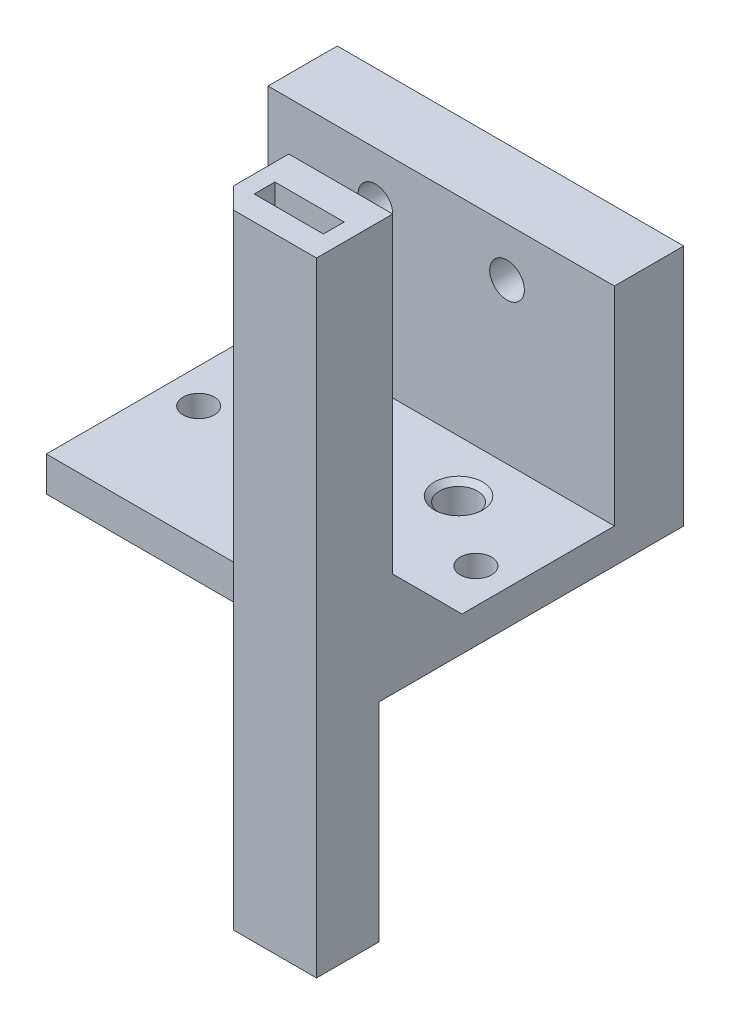
ISO-10303-21;
HEADER;
FILE_DESCRIPTION(('STEP AP214'),'2;1');
FILE_NAME('part.step','',(''),(''),'','','');
FILE_SCHEMA(('AUTOMOTIVE_DESIGN { 1 0 10303 214 1 1 1 1 }'));
ENDSEC;
DATA;
#1=APPLICATION_CONTEXT('core data for automotive mechanical design processes');
#2=APPLICATION_PROTOCOL_DEFINITION('international standard','automotive_design',2000,#1);
#3=PRODUCT_CONTEXT('',#1,'mechanical');
#4=PRODUCT('Part','Part','',(#3));
#5=PRODUCT_RELATED_PRODUCT_CATEGORY('part','',(#4));
#6=PRODUCT_DEFINITION_FORMATION('','',#4);
#7=PRODUCT_DEFINITION_CONTEXT('part definition',#1,'design');
#8=PRODUCT_DEFINITION('design','',#6,#7);
#9=PRODUCT_DEFINITION_SHAPE('','',#8);
#10=(LENGTH_UNIT() NAMED_UNIT(*) SI_UNIT(.MILLI.,.METRE.));
#11=(NAMED_UNIT(*) PLANE_ANGLE_UNIT() SI_UNIT($,.RADIAN.));
#12=(NAMED_UNIT(*) SI_UNIT($,.STERADIAN.) SOLID_ANGLE_UNIT());
#13=UNCERTAINTY_MEASURE_WITH_UNIT(LENGTH_MEASURE(1.E-05),#10,'distance_accuracy_value','');
#14=(GEOMETRIC_REPRESENTATION_CONTEXT(3) GLOBAL_UNCERTAINTY_ASSIGNED_CONTEXT((#13)) GLOBAL_UNIT_ASSIGNED_CONTEXT((#10,
#11,#12)) REPRESENTATION_CONTEXT('',''));
#15=CARTESIAN_POINT('',(0.,0.,0.));
#16=DIRECTION('',(0.,0.,1.));
#17=DIRECTION('',(1.,0.,0.));
#18=AXIS2_PLACEMENT_3D('',#15,#16,#17);
#19=CARTESIAN_POINT('',(-25.,5.,2.));
#20=DIRECTION('',(0.,0.,-1.));
#21=DIRECTION('',(-1.,0.,0.));
#22=AXIS2_PLACEMENT_3D('',#19,#20,#21);
#23=PLANE('',#22);
#24=DIRECTION('',(1.,0.,0.));
#25=VECTOR('',#24,1.);
#26=CARTESIAN_POINT('',(-25.,0.,2.));
#27=LINE('',#26,#25);
#28=CARTESIAN_POINT('',(-25.,0.,2.));
#29=VERTEX_POINT('',#28);
#30=CARTESIAN_POINT('',(4.99999999999997,0.,2.));
#31=VERTEX_POINT('',#30);
#32=EDGE_CURVE('E177',#29,#31,#27,.T.);
#33=ORIENTED_EDGE('',*,*,#32,.T.);
#34=DIRECTION('',(0.,1.,0.));
#35=VECTOR('',#34,1.);
#36=CARTESIAN_POINT('',(4.99999999999997,5.,2.));
#37=LINE('',#36,#35);
#38=CARTESIAN_POINT('',(4.99999999999997,5.,2.));
#39=VERTEX_POINT('',#38);
#40=EDGE_CURVE('E364',#31,#39,#37,.T.);
#41=ORIENTED_EDGE('',*,*,#40,.T.);
#42=DIRECTION('',(1.,0.,0.));
#43=VECTOR('',#42,1.);
#44=CARTESIAN_POINT('',(-25.,5.,2.));
#45=LINE('',#44,#43);
#46=CARTESIAN_POINT('',(-25.,5.,2.));
#47=VERTEX_POINT('',#46);
#48=EDGE_CURVE('E311',#47,#39,#45,.T.);
#49=ORIENTED_EDGE('',*,*,#48,.F.);
#50=DIRECTION('',(0.,-1.,0.));
#51=VECTOR('',#50,1.);
#52=CARTESIAN_POINT('',(-25.,5.,2.));
#53=LINE('',#52,#51);
#54=EDGE_CURVE('E314',#47,#29,#53,.T.);
#55=ORIENTED_EDGE('',*,*,#54,.T.);
#56=EDGE_LOOP('',(#33,#41,#49,#55));
#57=FACE_BOUND('',#56,.T.);
#58=ADVANCED_FACE('F32',(#57),#23,.F.);
#59=CARTESIAN_POINT('',(0.,5.,0.));
#60=DIRECTION('',(0.,-1.,0.));
#61=DIRECTION('',(0.,0.,-1.));
#62=AXIS2_PLACEMENT_3D('',#59,#60,#61);
#63=PLANE('',#62);
#64=CARTESIAN_POINT('',(0.,5.,-6.));
#65=DIRECTION('',(0.,-1.,0.));
#66=DIRECTION('',(0.,0.,-1.));
#67=AXIS2_PLACEMENT_3D('',#64,#65,#66);
#68=CIRCLE('',#67,3.50000000000002);
#69=CARTESIAN_POINT('',(0.,5.,-9.50000000000002));
#70=VERTEX_POINT('',#69);
#71=EDGE_CURVE('E340',#70,#70,#68,.T.);
#72=ORIENTED_EDGE('',*,*,#71,.T.);
#73=EDGE_LOOP('',(#72));
#74=FACE_BOUND('',#73,.T.);
#75=CARTESIAN_POINT('',(-10.,5.,-22.5));
#76=DIRECTION('',(0.,-1.,0.));
#77=DIRECTION('',(0.,0.,-1.));
#78=AXIS2_PLACEMENT_3D('',#75,#76,#77);
#79=CIRCLE('',#78,3.50000000000002);
#80=CARTESIAN_POINT('',(-10.,5.,-26.));
#81=VERTEX_POINT('',#80);
#82=EDGE_CURVE('E337',#81,#81,#79,.T.);
#83=ORIENTED_EDGE('',*,*,#82,.T.);
#84=EDGE_LOOP('',(#83));
#85=FACE_BOUND('',#84,.T.);
#86=CARTESIAN_POINT('',(10.,5.,-22.5));
#87=DIRECTION('',(0.,-1.,0.));
#88=DIRECTION('',(0.,0.,-1.));
#89=AXIS2_PLACEMENT_3D('',#86,#87,#88);
#90=CIRCLE('',#89,3.50000000000002);
#91=CARTESIAN_POINT('',(10.,5.,-26.));
#92=VERTEX_POINT('',#91);
#93=EDGE_CURVE('E334',#92,#92,#90,.T.);
#94=ORIENTED_EDGE('',*,*,#93,.T.);
#95=EDGE_LOOP('',(#94));
#96=FACE_BOUND('',#95,.T.);
#97=CARTESIAN_POINT('',(20.,5.,-15.));
#98=DIRECTION('',(0.,1.,0.));
#99=DIRECTION('',(0.,0.,1.));
#100=AXIS2_PLACEMENT_3D('',#97,#98,#99);
#101=CIRCLE('',#100,2.25);
#102=CARTESIAN_POINT('',(20.,5.,-12.75));
#103=VERTEX_POINT('',#102);
#104=EDGE_CURVE('E288',#103,#103,#101,.T.);
#105=ORIENTED_EDGE('',*,*,#104,.F.);
#106=EDGE_LOOP('',(#105));
#107=FACE_BOUND('',#106,.T.);
#108=CARTESIAN_POINT('',(-20.,5.,-15.));
#109=DIRECTION('',(0.,1.,0.));
#110=DIRECTION('',(0.,0.,1.));
#111=AXIS2_PLACEMENT_3D('',#108,#109,#110);
#112=CIRCLE('',#111,2.25);
#113=CARTESIAN_POINT('',(-20.,5.,-12.75));
#114=VERTEX_POINT('',#113);
#115=EDGE_CURVE('E294',#114,#114,#112,.T.);
#116=ORIENTED_EDGE('',*,*,#115,.F.);
#117=EDGE_LOOP('',(#116));
#118=FACE_BOUND('',#117,.T.);
#119=ORIENTED_EDGE('',*,*,#48,.T.);
#120=DIRECTION('',(0.,0.,-1.));
#121=VECTOR('',#120,1.);
#122=CARTESIAN_POINT('',(4.99999999999997,5.,0.));
#123=LINE('',#122,#121);
#124=CARTESIAN_POINT('',(4.99999999999997,5.,-8.00000000000006));
#125=VERTEX_POINT('',#124);
#126=EDGE_CURVE('E366',#39,#125,#123,.T.);
#127=ORIENTED_EDGE('',*,*,#126,.T.);
#128=DIRECTION('',(1.,0.,0.));
#129=VECTOR('',#128,1.);
#130=CARTESIAN_POINT('',(0.,5.,-8.00000000000006));
#131=LINE('',#130,#129);
#132=CARTESIAN_POINT('',(25.,5.,-8.00000000000006));
#133=VERTEX_POINT('',#132);
#134=EDGE_CURVE('E54',#125,#133,#131,.T.);
#135=ORIENTED_EDGE('',*,*,#134,.T.);
#136=DIRECTION('',(0.,0.,-1.));
#137=VECTOR('',#136,1.);
#138=CARTESIAN_POINT('',(25.,5.,0.));
#139=LINE('',#138,#137);
#140=CARTESIAN_POINT('',(25.,5.,-30.));
#141=VERTEX_POINT('',#140);
#142=EDGE_CURVE('E176',#133,#141,#139,.T.);
#143=ORIENTED_EDGE('',*,*,#142,.T.);
#144=DIRECTION('',(1.,0.,0.));
#145=VECTOR('',#144,1.);
#146=CARTESIAN_POINT('',(-25.,5.,-30.));
#147=LINE('',#146,#145);
#148=CARTESIAN_POINT('',(-25.,5.,-30.));
#149=VERTEX_POINT('',#148);
#150=EDGE_CURVE('E271',#149,#141,#147,.T.);
#151=ORIENTED_EDGE('',*,*,#150,.F.);
#152=DIRECTION('',(0.,0.,1.));
#153=VECTOR('',#152,1.);
#154=CARTESIAN_POINT('',(-25.,5.,0.));
#155=LINE('',#154,#153);
#156=EDGE_CURVE('E309',#149,#47,#155,.T.);
#157=ORIENTED_EDGE('',*,*,#156,.T.);
#158=EDGE_LOOP('',(#119,#127,#135,#143,#151,#157));
#159=FACE_BOUND('',#158,.T.);
#160=ADVANCED_FACE('F381',(#74,#85,#96,#107,#118,#159),#63,.F.);
#161=CARTESIAN_POINT('',(0.,0.,0.));
#162=DIRECTION('',(0.,-1.,0.));
#163=DIRECTION('',(0.,0.,-1.));
#164=AXIS2_PLACEMENT_3D('',#161,#162,#163);
#165=PLANE('',#164);
#166=DIRECTION('',(-0.707106781186551,0.,-0.707106781186544));
#167=VECTOR('',#166,1.);
#168=CARTESIAN_POINT('',(10.,0.,6.99999999999998));
#169=LINE('',#168,#167);
#170=CARTESIAN_POINT('',(10.,0.,6.99999999999998));
#171=VERTEX_POINT('',#170);
#172=EDGE_CURVE('E368',#171,#31,#169,.T.);
#173=ORIENTED_EDGE('',*,*,#172,.T.);
#174=ORIENTED_EDGE('',*,*,#32,.F.);
#175=DIRECTION('',(0.,0.,1.));
#176=VECTOR('',#175,1.);
#177=CARTESIAN_POINT('',(-25.,0.,0.));
#178=LINE('',#177,#176);
#179=CARTESIAN_POINT('',(-25.,0.,-40.));
#180=VERTEX_POINT('',#179);
#181=EDGE_CURVE('E316',#180,#29,#178,.T.);
#182=ORIENTED_EDGE('',*,*,#181,.F.);
#183=DIRECTION('',(-1.,0.,0.));
#184=VECTOR('',#183,1.);
#185=CARTESIAN_POINT('',(-25.,0.,-40.));
#186=LINE('',#185,#184);
#187=CARTESIAN_POINT('',(25.,0.,-40.));
#188=VERTEX_POINT('',#187);
#189=EDGE_CURVE('E173',#188,#180,#186,.T.);
#190=ORIENTED_EDGE('',*,*,#189,.F.);
#191=DIRECTION('',(0.,0.,-1.));
#192=VECTOR('',#191,1.);
#193=CARTESIAN_POINT('',(25.,0.,2.));
#194=LINE('',#193,#192);
#195=CARTESIAN_POINT('',(25.,0.,4.));
#196=VERTEX_POINT('',#195);
#197=EDGE_CURVE('E166',#196,#188,#194,.T.);
#198=ORIENTED_EDGE('',*,*,#197,.F.);
#199=DIRECTION('',(1.,0.,0.));
#200=VECTOR('',#199,1.);
#201=CARTESIAN_POINT('',(-25.,0.,4.));
#202=LINE('',#201,#200);
#203=CARTESIAN_POINT('',(10.,0.,4.));
#204=VERTEX_POINT('',#203);
#205=EDGE_CURVE('E170',#204,#196,#202,.T.);
#206=ORIENTED_EDGE('',*,*,#205,.F.);
#207=DIRECTION('',(0.,0.,-1.));
#208=VECTOR('',#207,1.);
#209=CARTESIAN_POINT('',(10.,0.,0.));
#210=LINE('',#209,#208);
#211=EDGE_CURVE('E362',#171,#204,#210,.T.);
#212=ORIENTED_EDGE('',*,*,#211,.F.);
#213=EDGE_LOOP('',(#173,#174,#182,#190,#198,#206,#212));
#214=FACE_BOUND('',#213,.T.);
#215=CARTESIAN_POINT('',(-20.,0.,-15.));
#216=DIRECTION('',(0.,1.,0.));
#217=DIRECTION('',(0.,0.,1.));
#218=AXIS2_PLACEMENT_3D('',#215,#216,#217);
#219=CIRCLE('',#218,2.25);
#220=CARTESIAN_POINT('',(-20.,0.,-12.75));
#221=VERTEX_POINT('',#220);
#222=EDGE_CURVE('E291',#221,#221,#219,.T.);
#223=ORIENTED_EDGE('',*,*,#222,.T.);
#224=EDGE_LOOP('',(#223));
#225=FACE_BOUND('',#224,.T.);
#226=CARTESIAN_POINT('',(10.,0.,-22.5));
#227=DIRECTION('',(0.,1.,0.));
#228=DIRECTION('',(0.,0.,1.));
#229=AXIS2_PLACEMENT_3D('',#226,#227,#228);
#230=CIRCLE('',#229,2.75);
#231=CARTESIAN_POINT('',(10.,0.,-19.75));
#232=VERTEX_POINT('',#231);
#233=EDGE_CURVE('E302',#232,#232,#230,.T.);
#234=ORIENTED_EDGE('',*,*,#233,.T.);
#235=EDGE_LOOP('',(#234));
#236=FACE_BOUND('',#235,.T.);
#237=CARTESIAN_POINT('',(-10.,0.,-22.5));
#238=DIRECTION('',(0.,1.,0.));
#239=DIRECTION('',(0.,0.,1.));
#240=AXIS2_PLACEMENT_3D('',#237,#238,#239);
#241=CIRCLE('',#240,2.75);
#242=CARTESIAN_POINT('',(-10.,0.,-19.75));
#243=VERTEX_POINT('',#242);
#244=EDGE_CURVE('E305',#243,#243,#241,.T.);
#245=ORIENTED_EDGE('',*,*,#244,.T.);
#246=EDGE_LOOP('',(#245));
#247=FACE_BOUND('',#246,.T.);
#248=CARTESIAN_POINT('',(0.,0.,-6.));
#249=DIRECTION('',(0.,1.,0.));
#250=DIRECTION('',(0.,0.,1.));
#251=AXIS2_PLACEMENT_3D('',#248,#249,#250);
#252=CIRCLE('',#251,2.75);
#253=CARTESIAN_POINT('',(0.,0.,-3.25));
#254=VERTEX_POINT('',#253);
#255=EDGE_CURVE('E297',#254,#254,#252,.T.);
#256=ORIENTED_EDGE('',*,*,#255,.T.);
#257=EDGE_LOOP('',(#256));
#258=FACE_BOUND('',#257,.T.);
#259=CARTESIAN_POINT('',(20.,0.,-15.));
#260=DIRECTION('',(0.,1.,0.));
#261=DIRECTION('',(0.,0.,1.));
#262=AXIS2_PLACEMENT_3D('',#259,#260,#261);
#263=CIRCLE('',#262,2.25);
#264=CARTESIAN_POINT('',(20.,0.,-12.75));
#265=VERTEX_POINT('',#264);
#266=EDGE_CURVE('E287',#265,#265,#263,.T.);
#267=ORIENTED_EDGE('',*,*,#266,.T.);
#268=EDGE_LOOP('',(#267));
#269=FACE_BOUND('',#268,.T.);
#270=ADVANCED_FACE('F167',(#214,#225,#236,#247,#258,#269),#165,.T.);
#271=CARTESIAN_POINT('',(-25.,5.,-40.));
#272=DIRECTION('',(0.,0.,1.));
#273=DIRECTION('',(1.,0.,0.));
#274=AXIS2_PLACEMENT_3D('',#271,#272,#273);
#275=PLANE('',#274);
#276=CARTESIAN_POINT('',(9.50000000000001,28.,-40.));
#277=DIRECTION('',(0.,0.,-1.));
#278=DIRECTION('',(-1.,0.,0.));
#279=AXIS2_PLACEMENT_3D('',#276,#277,#278);
#280=CIRCLE('',#279,2.5);
#281=CARTESIAN_POINT('',(7.00000000000001,28.,-40.));
#282=VERTEX_POINT('',#281);
#283=EDGE_CURVE('E261',#282,#282,#280,.T.);
#284=ORIENTED_EDGE('',*,*,#283,.F.);
#285=EDGE_LOOP('',(#284));
#286=FACE_BOUND('',#285,.T.);
#287=CARTESIAN_POINT('',(-9.49999999999999,28.,-40.));
#288=DIRECTION('',(0.,0.,-1.));
#289=DIRECTION('',(-1.,0.,0.));
#290=AXIS2_PLACEMENT_3D('',#287,#288,#289);
#291=CIRCLE('',#290,2.49999999999999);
#292=CARTESIAN_POINT('',(-12.,28.,-40.));
#293=VERTEX_POINT('',#292);
#294=EDGE_CURVE('E252',#293,#293,#291,.T.);
#295=ORIENTED_EDGE('',*,*,#294,.F.);
#296=EDGE_LOOP('',(#295));
#297=FACE_BOUND('',#296,.T.);
#298=ORIENTED_EDGE('',*,*,#189,.T.);
#299=DIRECTION('',(0.,-1.,0.));
#300=VECTOR('',#299,1.);
#301=CARTESIAN_POINT('',(-25.,5.,-40.));
#302=LINE('',#301,#300);
#303=CARTESIAN_POINT('',(-25.,35.,-40.));
#304=VERTEX_POINT('',#303);
#305=EDGE_CURVE('E322',#304,#180,#302,.T.);
#306=ORIENTED_EDGE('',*,*,#305,.F.);
#307=DIRECTION('',(-1.,0.,0.));
#308=VECTOR('',#307,1.);
#309=CARTESIAN_POINT('',(25.,35.,-40.));
#310=LINE('',#309,#308);
#311=CARTESIAN_POINT('',(25.,35.,-40.));
#312=VERTEX_POINT('',#311);
#313=EDGE_CURVE('E267',#312,#304,#310,.T.);
#314=ORIENTED_EDGE('',*,*,#313,.F.);
#315=DIRECTION('',(0.,-1.,0.));
#316=VECTOR('',#315,1.);
#317=CARTESIAN_POINT('',(25.,5.,-40.));
#318=LINE('',#317,#316);
#319=EDGE_CURVE('E325',#312,#188,#318,.T.);
#320=ORIENTED_EDGE('',*,*,#319,.T.);
#321=EDGE_LOOP('',(#298,#306,#314,#320));
#322=FACE_BOUND('',#321,.T.);
#323=ADVANCED_FACE('F433',(#286,#297,#322),#275,.F.);
#324=CARTESIAN_POINT('',(-25.,5.,0.));
#325=DIRECTION('',(1.,0.,0.));
#326=DIRECTION('',(0.,0.,-1.));
#327=AXIS2_PLACEMENT_3D('',#324,#325,#326);
#328=PLANE('',#327);
#329=ORIENTED_EDGE('',*,*,#181,.T.);
#330=ORIENTED_EDGE('',*,*,#54,.F.);
#331=ORIENTED_EDGE('',*,*,#156,.F.);
#332=DIRECTION('',(0.,-1.,0.));
#333=VECTOR('',#332,1.);
#334=CARTESIAN_POINT('',(-25.,35.,-30.));
#335=LINE('',#334,#333);
#336=CARTESIAN_POINT('',(-25.,35.,-30.));
#337=VERTEX_POINT('',#336);
#338=EDGE_CURVE('E284',#337,#149,#335,.T.);
#339=ORIENTED_EDGE('',*,*,#338,.F.);
#340=DIRECTION('',(0.,0.,1.));
#341=VECTOR('',#340,1.);
#342=CARTESIAN_POINT('',(-25.,35.,-40.));
#343=LINE('',#342,#341);
#344=EDGE_CURVE('E270',#304,#337,#343,.T.);
#345=ORIENTED_EDGE('',*,*,#344,.F.);
#346=ORIENTED_EDGE('',*,*,#305,.T.);
#347=EDGE_LOOP('',(#329,#330,#331,#339,#345,#346));
#348=FACE_BOUND('',#347,.T.);
#349=ADVANCED_FACE('F430',(#348),#328,.F.);
#350=CARTESIAN_POINT('',(25.,5.,2.));
#351=DIRECTION('',(-1.,0.,0.));
#352=DIRECTION('',(0.,0.,1.));
#353=AXIS2_PLACEMENT_3D('',#350,#351,#352);
#354=PLANE('',#353);
#355=DIRECTION('',(0.,0.,1.));
#356=VECTOR('',#355,1.);
#357=CARTESIAN_POINT('',(25.,-30.,2.));
#358=LINE('',#357,#356);
#359=CARTESIAN_POINT('',(25.,-30.,4.));
#360=VERTEX_POINT('',#359);
#361=CARTESIAN_POINT('',(25.,-30.,13.));
#362=VERTEX_POINT('',#361);
#363=EDGE_CURVE('E186',#360,#362,#358,.T.);
#364=ORIENTED_EDGE('',*,*,#363,.F.);
#365=DIRECTION('',(0.,-1.,0.));
#366=VECTOR('',#365,1.);
#367=CARTESIAN_POINT('',(25.,0.,4.));
#368=LINE('',#367,#366);
#369=EDGE_CURVE('E46',#196,#360,#368,.T.);
#370=ORIENTED_EDGE('',*,*,#369,.F.);
#371=ORIENTED_EDGE('',*,*,#197,.T.);
#372=ORIENTED_EDGE('',*,*,#319,.F.);
#373=DIRECTION('',(0.,0.,-1.));
#374=VECTOR('',#373,1.);
#375=CARTESIAN_POINT('',(25.,35.,-40.));
#376=LINE('',#375,#374);
#377=CARTESIAN_POINT('',(25.,35.,-30.));
#378=VERTEX_POINT('',#377);
#379=EDGE_CURVE('E275',#378,#312,#376,.T.);
#380=ORIENTED_EDGE('',*,*,#379,.F.);
#381=DIRECTION('',(0.,-1.,0.));
#382=VECTOR('',#381,1.);
#383=CARTESIAN_POINT('',(25.,35.,-30.));
#384=LINE('',#383,#382);
#385=EDGE_CURVE('E278',#378,#141,#384,.T.);
#386=ORIENTED_EDGE('',*,*,#385,.T.);
#387=ORIENTED_EDGE('',*,*,#142,.F.);
#388=DIRECTION('',(0.,0.707106781186544,0.707106781186551));
#389=VECTOR('',#388,1.);
#390=CARTESIAN_POINT('',(25.,10.,-2.99999999999998));
#391=LINE('',#390,#389);
#392=CARTESIAN_POINT('',(25.,15.,2.));
#393=VERTEX_POINT('',#392);
#394=EDGE_CURVE('E352',#133,#393,#391,.T.);
#395=ORIENTED_EDGE('',*,*,#394,.T.);
#396=DIRECTION('',(0.,-1.,0.));
#397=VECTOR('',#396,1.);
#398=CARTESIAN_POINT('',(25.,60.,2.));
#399=LINE('',#398,#397);
#400=CARTESIAN_POINT('',(25.,60.,2.));
#401=VERTEX_POINT('',#400);
#402=EDGE_CURVE('E249',#401,#393,#399,.T.);
#403=ORIENTED_EDGE('',*,*,#402,.F.);
#404=DIRECTION('',(0.,0.,1.));
#405=VECTOR('',#404,1.);
#406=CARTESIAN_POINT('',(25.,60.,2.));
#407=LINE('',#406,#405);
#408=CARTESIAN_POINT('',(25.,60.,13.));
#409=VERTEX_POINT('',#408);
#410=EDGE_CURVE('E228',#401,#409,#407,.T.);
#411=ORIENTED_EDGE('',*,*,#410,.T.);
#412=DIRECTION('',(0.,-1.,0.));
#413=VECTOR('',#412,1.);
#414=CARTESIAN_POINT('',(25.,60.,13.));
#415=LINE('',#414,#413);
#416=EDGE_CURVE('E248',#409,#362,#415,.T.);
#417=ORIENTED_EDGE('',*,*,#416,.T.);
#418=EDGE_LOOP('',(#364,#370,#371,#372,#380,#386,#387,#395,#403,#411,#417));
#419=FACE_BOUND('',#418,.T.);
#420=ADVANCED_FACE('F184',(#419),#354,.F.);
#421=CARTESIAN_POINT('',(-10.,5.,-22.5));
#422=DIRECTION('',(0.,-1.,0.));
#423=DIRECTION('',(0.,0.,-1.));
#424=AXIS2_PLACEMENT_3D('',#421,#422,#423);
#425=CYLINDRICAL_SURFACE('',#424,2.75);
#426=CARTESIAN_POINT('',(-10.,4.24999999999999,-22.5));
#427=DIRECTION('',(0.,-1.,0.));
#428=DIRECTION('',(0.,0.,-1.));
#429=AXIS2_PLACEMENT_3D('',#426,#427,#428);
#430=CIRCLE('',#429,2.75);
#431=CARTESIAN_POINT('',(-10.,4.24999999999999,-25.25));
#432=VERTEX_POINT('',#431);
#433=EDGE_CURVE('E343',#432,#432,#430,.F.);
#434=ORIENTED_EDGE('',*,*,#433,.T.);
#435=EDGE_LOOP('',(#434));
#436=FACE_BOUND('',#435,.T.);
#437=ORIENTED_EDGE('',*,*,#244,.F.);
#438=EDGE_LOOP('',(#437));
#439=FACE_BOUND('',#438,.T.);
#440=ADVANCED_FACE('F567',(#436,#439),#425,.F.);
#441=CARTESIAN_POINT('',(10.,5.,-22.5));
#442=DIRECTION('',(0.,-1.,0.));
#443=DIRECTION('',(0.,0.,-1.));
#444=AXIS2_PLACEMENT_3D('',#441,#442,#443);
#445=CYLINDRICAL_SURFACE('',#444,2.75);
#446=CARTESIAN_POINT('',(10.,4.24999999999999,-22.5));
#447=DIRECTION('',(0.,-1.,0.));
#448=DIRECTION('',(0.,0.,-1.));
#449=AXIS2_PLACEMENT_3D('',#446,#447,#448);
#450=CIRCLE('',#449,2.75);
#451=CARTESIAN_POINT('',(10.,4.24999999999999,-25.25));
#452=VERTEX_POINT('',#451);
#453=EDGE_CURVE('E346',#452,#452,#450,.F.);
#454=ORIENTED_EDGE('',*,*,#453,.T.);
#455=EDGE_LOOP('',(#454));
#456=FACE_BOUND('',#455,.T.);
#457=ORIENTED_EDGE('',*,*,#233,.F.);
#458=EDGE_LOOP('',(#457));
#459=FACE_BOUND('',#458,.T.);
#460=ADVANCED_FACE('F555',(#456,#459),#445,.F.);
#461=CARTESIAN_POINT('',(0.,5.,-6.));
#462=DIRECTION('',(0.,-1.,0.));
#463=DIRECTION('',(0.,0.,-1.));
#464=AXIS2_PLACEMENT_3D('',#461,#462,#463);
#465=CYLINDRICAL_SURFACE('',#464,2.75);
#466=CARTESIAN_POINT('',(0.,4.24999999999999,-6.));
#467=DIRECTION('',(0.,-1.,0.));
#468=DIRECTION('',(0.,0.,-1.));
#469=AXIS2_PLACEMENT_3D('',#466,#467,#468);
#470=CIRCLE('',#469,2.75);
#471=CARTESIAN_POINT('',(0.,4.24999999999999,-8.75));
#472=VERTEX_POINT('',#471);
#473=EDGE_CURVE('E327',#472,#472,#470,.F.);
#474=ORIENTED_EDGE('',*,*,#473,.T.);
#475=EDGE_LOOP('',(#474));
#476=FACE_BOUND('',#475,.T.);
#477=ORIENTED_EDGE('',*,*,#255,.F.);
#478=EDGE_LOOP('',(#477));
#479=FACE_BOUND('',#478,.T.);
#480=ADVANCED_FACE('F549',(#476,#479),#465,.F.);
#481=CARTESIAN_POINT('',(-20.,5.,-15.));
#482=DIRECTION('',(0.,-1.,0.));
#483=DIRECTION('',(0.,0.,-1.));
#484=AXIS2_PLACEMENT_3D('',#481,#482,#483);
#485=CYLINDRICAL_SURFACE('',#484,2.25);
#486=ORIENTED_EDGE('',*,*,#115,.T.);
#487=EDGE_LOOP('',(#486));
#488=FACE_BOUND('',#487,.T.);
#489=ORIENTED_EDGE('',*,*,#222,.F.);
#490=EDGE_LOOP('',(#489));
#491=FACE_BOUND('',#490,.T.);
#492=ADVANCED_FACE('F554',(#488,#491),#485,.F.);
#493=CARTESIAN_POINT('',(20.,5.,-15.));
#494=DIRECTION('',(0.,-1.,0.));
#495=DIRECTION('',(0.,0.,-1.));
#496=AXIS2_PLACEMENT_3D('',#493,#494,#495);
#497=CYLINDRICAL_SURFACE('',#496,2.25);
#498=ORIENTED_EDGE('',*,*,#104,.T.);
#499=EDGE_LOOP('',(#498));
#500=FACE_BOUND('',#499,.T.);
#501=ORIENTED_EDGE('',*,*,#266,.F.);
#502=EDGE_LOOP('',(#501));
#503=FACE_BOUND('',#502,.T.);
#504=ADVANCED_FACE('F609',(#500,#503),#497,.F.);
#505=CARTESIAN_POINT('',(-25.,35.,-30.));
#506=DIRECTION('',(0.,0.,-1.));
#507=DIRECTION('',(-1.,0.,0.));
#508=AXIS2_PLACEMENT_3D('',#505,#506,#507);
#509=PLANE('',#508);
#510=CARTESIAN_POINT('',(9.5,28.,-30.));
#511=DIRECTION('',(0.,0.,-1.));
#512=DIRECTION('',(-1.,0.,0.));
#513=AXIS2_PLACEMENT_3D('',#510,#511,#512);
#514=CIRCLE('',#513,2.5);
#515=CARTESIAN_POINT('',(7.,28.,-30.));
#516=VERTEX_POINT('',#515);
#517=EDGE_CURVE('E281',#516,#516,#514,.T.);
#518=ORIENTED_EDGE('',*,*,#517,.T.);
#519=EDGE_LOOP('',(#518));
#520=FACE_BOUND('',#519,.T.);
#521=CARTESIAN_POINT('',(-9.5,28.,-30.));
#522=DIRECTION('',(0.,0.,-1.));
#523=DIRECTION('',(-1.,0.,0.));
#524=AXIS2_PLACEMENT_3D('',#521,#522,#523);
#525=CIRCLE('',#524,2.49999999999999);
#526=CARTESIAN_POINT('',(-12.,28.,-30.));
#527=VERTEX_POINT('',#526);
#528=EDGE_CURVE('E264',#527,#527,#525,.T.);
#529=ORIENTED_EDGE('',*,*,#528,.T.);
#530=EDGE_LOOP('',(#529));
#531=FACE_BOUND('',#530,.T.);
#532=ORIENTED_EDGE('',*,*,#150,.T.);
#533=ORIENTED_EDGE('',*,*,#385,.F.);
#534=DIRECTION('',(1.,0.,0.));
#535=VECTOR('',#534,1.);
#536=CARTESIAN_POINT('',(-25.,35.,-30.));
#537=LINE('',#536,#535);
#538=EDGE_CURVE('E273',#337,#378,#537,.T.);
#539=ORIENTED_EDGE('',*,*,#538,.F.);
#540=ORIENTED_EDGE('',*,*,#338,.T.);
#541=EDGE_LOOP('',(#532,#533,#539,#540));
#542=FACE_BOUND('',#541,.T.);
#543=ADVANCED_FACE('F604',(#520,#531,#542),#509,.F.);
#544=CARTESIAN_POINT('',(0.,35.,0.));
#545=DIRECTION('',(0.,1.,0.));
#546=DIRECTION('',(0.,0.,1.));
#547=AXIS2_PLACEMENT_3D('',#544,#545,#546);
#548=PLANE('',#547);
#549=ORIENTED_EDGE('',*,*,#313,.T.);
#550=ORIENTED_EDGE('',*,*,#344,.T.);
#551=ORIENTED_EDGE('',*,*,#538,.T.);
#552=ORIENTED_EDGE('',*,*,#379,.T.);
#553=EDGE_LOOP('',(#549,#550,#551,#552));
#554=FACE_BOUND('',#553,.T.);
#555=ADVANCED_FACE('F596',(#554),#548,.T.);
#556=CARTESIAN_POINT('',(-9.50000000000003,28.,2.00000000000002));
#557=DIRECTION('',(0.,0.,-1.));
#558=DIRECTION('',(-1.,0.,0.));
#559=AXIS2_PLACEMENT_3D('',#556,#557,#558);
#560=CYLINDRICAL_SURFACE('',#559,2.49999999999999);
#561=ORIENTED_EDGE('',*,*,#294,.T.);
#562=EDGE_LOOP('',(#561));
#563=FACE_BOUND('',#562,.T.);
#564=ORIENTED_EDGE('',*,*,#528,.F.);
#565=EDGE_LOOP('',(#564));
#566=FACE_BOUND('',#565,.T.);
#567=ADVANCED_FACE('F586',(#563,#566),#560,.F.);
#568=CARTESIAN_POINT('',(9.49999999999997,28.,2.00000000000003));
#569=DIRECTION('',(0.,0.,-1.));
#570=DIRECTION('',(-1.,0.,0.));
#571=AXIS2_PLACEMENT_3D('',#568,#569,#570);
#572=CYLINDRICAL_SURFACE('',#571,2.5);
#573=ORIENTED_EDGE('',*,*,#283,.T.);
#574=EDGE_LOOP('',(#573));
#575=FACE_BOUND('',#574,.T.);
#576=ORIENTED_EDGE('',*,*,#517,.F.);
#577=EDGE_LOOP('',(#576));
#578=FACE_BOUND('',#577,.T.);
#579=ADVANCED_FACE('F442',(#575,#578),#572,.F.);
#580=CARTESIAN_POINT('',(0.,4.24999999999999,-6.));
#581=DIRECTION('',(0.,1.,0.));
#582=DIRECTION('',(0.,0.,1.));
#583=AXIS2_PLACEMENT_3D('',#580,#581,#582);
#584=CONICAL_SURFACE('',#583,2.75,0.785398163397452);
#585=ORIENTED_EDGE('',*,*,#71,.F.);
#586=EDGE_LOOP('',(#585));
#587=FACE_BOUND('',#586,.T.);
#588=ORIENTED_EDGE('',*,*,#473,.F.);
#589=EDGE_LOOP('',(#588));
#590=FACE_BOUND('',#589,.T.);
#591=ADVANCED_FACE('F438',(#587,#590),#584,.F.);
#592=CARTESIAN_POINT('',(-10.,4.24999999999999,-22.5));
#593=DIRECTION('',(0.,1.,0.));
#594=DIRECTION('',(0.,0.,1.));
#595=AXIS2_PLACEMENT_3D('',#592,#593,#594);
#596=CONICAL_SURFACE('',#595,2.75,0.785398163397451);
#597=ORIENTED_EDGE('',*,*,#82,.F.);
#598=EDGE_LOOP('',(#597));
#599=FACE_BOUND('',#598,.T.);
#600=ORIENTED_EDGE('',*,*,#433,.F.);
#601=EDGE_LOOP('',(#600));
#602=FACE_BOUND('',#601,.T.);
#603=ADVANCED_FACE('F441',(#599,#602),#596,.F.);
#604=CARTESIAN_POINT('',(10.,4.24999999999999,-22.5));
#605=DIRECTION('',(0.,1.,0.));
#606=DIRECTION('',(0.,0.,1.));
#607=AXIS2_PLACEMENT_3D('',#604,#605,#606);
#608=CONICAL_SURFACE('',#607,2.75,0.785398163397451);
#609=ORIENTED_EDGE('',*,*,#93,.F.);
#610=EDGE_LOOP('',(#609));
#611=FACE_BOUND('',#610,.T.);
#612=ORIENTED_EDGE('',*,*,#453,.F.);
#613=EDGE_LOOP('',(#612));
#614=FACE_BOUND('',#613,.T.);
#615=ADVANCED_FACE('F446',(#611,#614),#608,.F.);
#616=CARTESIAN_POINT('',(25.,60.,2.));
#617=DIRECTION('',(0.,0.,-1.));
#618=DIRECTION('',(-1.,0.,0.));
#619=AXIS2_PLACEMENT_3D('',#616,#617,#618);
#620=PLANE('',#619);
#621=ORIENTED_EDGE('',*,*,#402,.T.);
#622=DIRECTION('',(-1.,0.,0.));
#623=VECTOR('',#622,1.);
#624=CARTESIAN_POINT('',(25.,15.,2.));
#625=LINE('',#624,#623);
#626=CARTESIAN_POINT('',(10.,15.,2.));
#627=VERTEX_POINT('',#626);
#628=EDGE_CURVE('E350',#393,#627,#625,.T.);
#629=ORIENTED_EDGE('',*,*,#628,.T.);
#630=DIRECTION('',(0.,-1.,0.));
#631=VECTOR('',#630,1.);
#632=CARTESIAN_POINT('',(10.,60.,2.));
#633=LINE('',#632,#631);
#634=CARTESIAN_POINT('',(10.,60.,2.));
#635=VERTEX_POINT('',#634);
#636=EDGE_CURVE('E253',#635,#627,#633,.T.);
#637=ORIENTED_EDGE('',*,*,#636,.F.);
#638=DIRECTION('',(1.,0.,0.));
#639=VECTOR('',#638,1.);
#640=CARTESIAN_POINT('',(25.,60.,2.));
#641=LINE('',#640,#639);
#642=EDGE_CURVE('E245',#635,#401,#641,.T.);
#643=ORIENTED_EDGE('',*,*,#642,.T.);
#644=EDGE_LOOP('',(#621,#629,#637,#643));
#645=FACE_BOUND('',#644,.T.);
#646=ADVANCED_FACE('F394',(#645),#620,.T.);
#647=CARTESIAN_POINT('',(10.,60.,2.));
#648=DIRECTION('',(-1.,0.,0.));
#649=DIRECTION('',(0.,0.,1.));
#650=AXIS2_PLACEMENT_3D('',#647,#648,#649);
#651=PLANE('',#650);
#652=DIRECTION('',(0.,1.,0.));
#653=VECTOR('',#652,1.);
#654=CARTESIAN_POINT('',(10.,60.,4.00000000000001));
#655=LINE('',#654,#653);
#656=CARTESIAN_POINT('',(10.,-30.,4.));
#657=VERTEX_POINT('',#656);
#658=EDGE_CURVE('E181',#657,#204,#655,.T.);
#659=ORIENTED_EDGE('',*,*,#658,.F.);
#660=DIRECTION('',(0.,0.,-1.));
#661=VECTOR('',#660,1.);
#662=CARTESIAN_POINT('',(10.,-30.,2.));
#663=LINE('',#662,#661);
#664=CARTESIAN_POINT('',(10.,-30.,9.99999999999999));
#665=VERTEX_POINT('',#664);
#666=EDGE_CURVE('E210',#665,#657,#663,.T.);
#667=ORIENTED_EDGE('',*,*,#666,.F.);
#668=DIRECTION('',(0.,-1.,0.));
#669=VECTOR('',#668,1.);
#670=CARTESIAN_POINT('',(10.,60.,9.99999999999999));
#671=LINE('',#670,#669);
#672=CARTESIAN_POINT('',(10.,60.,9.99999999999999));
#673=VERTEX_POINT('',#672);
#674=EDGE_CURVE('E256',#673,#665,#671,.T.);
#675=ORIENTED_EDGE('',*,*,#674,.F.);
#676=DIRECTION('',(0.,0.,-1.));
#677=VECTOR('',#676,1.);
#678=CARTESIAN_POINT('',(10.,60.,2.));
#679=LINE('',#678,#677);
#680=EDGE_CURVE('E242',#673,#635,#679,.T.);
#681=ORIENTED_EDGE('',*,*,#680,.T.);
#682=ORIENTED_EDGE('',*,*,#636,.T.);
#683=DIRECTION('',(0.,-0.707106781186544,-0.707106781186551));
#684=VECTOR('',#683,1.);
#685=CARTESIAN_POINT('',(10.,5.,-8.00000000000006));
#686=LINE('',#685,#684);
#687=CARTESIAN_POINT('',(10.,9.99999999999998,-3.00000000000003));
#688=VERTEX_POINT('',#687);
#689=EDGE_CURVE('E354',#627,#688,#686,.T.);
#690=ORIENTED_EDGE('',*,*,#689,.T.);
#691=DIRECTION('',(0.,0.,1.));
#692=VECTOR('',#691,1.);
#693=CARTESIAN_POINT('',(10.,9.99999999999998,2.));
#694=LINE('',#693,#692);
#695=CARTESIAN_POINT('',(10.,9.99999999999998,6.99999999999998));
#696=VERTEX_POINT('',#695);
#697=EDGE_CURVE('E357',#688,#696,#694,.T.);
#698=ORIENTED_EDGE('',*,*,#697,.T.);
#699=DIRECTION('',(0.,-1.,0.));
#700=VECTOR('',#699,1.);
#701=CARTESIAN_POINT('',(10.,60.,6.99999999999998));
#702=LINE('',#701,#700);
#703=EDGE_CURVE('E359',#696,#171,#702,.T.);
#704=ORIENTED_EDGE('',*,*,#703,.T.);
#705=ORIENTED_EDGE('',*,*,#211,.T.);
#706=EDGE_LOOP('',(#659,#667,#675,#681,#682,#690,#698,#704,#705));
#707=FACE_BOUND('',#706,.T.);
#708=ADVANCED_FACE('F389',(#707),#651,.T.);
#709=CARTESIAN_POINT('',(13.,60.,13.));
#710=DIRECTION('',(-0.707106781186549,0.,0.707106781186546));
#711=DIRECTION('',(0.707106781186546,0.,0.707106781186549));
#712=AXIS2_PLACEMENT_3D('',#709,#710,#711);
#713=PLANE('',#712);
#714=ORIENTED_EDGE('',*,*,#674,.T.);
#715=DIRECTION('',(-0.707106781186546,0.,-0.707106781186549));
#716=VECTOR('',#715,1.);
#717=CARTESIAN_POINT('',(13.,-30.,13.));
#718=LINE('',#717,#716);
#719=CARTESIAN_POINT('',(13.,-30.,13.));
#720=VERTEX_POINT('',#719);
#721=EDGE_CURVE('E207',#720,#665,#718,.T.);
#722=ORIENTED_EDGE('',*,*,#721,.F.);
#723=DIRECTION('',(0.,-1.,0.));
#724=VECTOR('',#723,1.);
#725=CARTESIAN_POINT('',(13.,60.,13.));
#726=LINE('',#725,#724);
#727=CARTESIAN_POINT('',(13.,60.,13.));
#728=VERTEX_POINT('',#727);
#729=EDGE_CURVE('E258',#728,#720,#726,.T.);
#730=ORIENTED_EDGE('',*,*,#729,.F.);
#731=DIRECTION('',(-0.707106781186546,0.,-0.707106781186549));
#732=VECTOR('',#731,1.);
#733=CARTESIAN_POINT('',(13.,60.,13.));
#734=LINE('',#733,#732);
#735=EDGE_CURVE('E239',#728,#673,#734,.T.);
#736=ORIENTED_EDGE('',*,*,#735,.T.);
#737=EDGE_LOOP('',(#714,#722,#730,#736));
#738=FACE_BOUND('',#737,.T.);
#739=ADVANCED_FACE('F411',(#738),#713,.T.);
#740=CARTESIAN_POINT('',(25.,60.,13.));
#741=DIRECTION('',(0.,0.,1.));
#742=DIRECTION('',(1.,0.,0.));
#743=AXIS2_PLACEMENT_3D('',#740,#741,#742);
#744=PLANE('',#743);
#745=ORIENTED_EDGE('',*,*,#729,.T.);
#746=DIRECTION('',(-1.,0.,0.));
#747=VECTOR('',#746,1.);
#748=CARTESIAN_POINT('',(25.,-30.,13.));
#749=LINE('',#748,#747);
#750=EDGE_CURVE('E204',#362,#720,#749,.T.);
#751=ORIENTED_EDGE('',*,*,#750,.F.);
#752=ORIENTED_EDGE('',*,*,#416,.F.);
#753=DIRECTION('',(-1.,0.,0.));
#754=VECTOR('',#753,1.);
#755=CARTESIAN_POINT('',(25.,60.,13.));
#756=LINE('',#755,#754);
#757=EDGE_CURVE('E236',#409,#728,#756,.T.);
#758=ORIENTED_EDGE('',*,*,#757,.T.);
#759=EDGE_LOOP('',(#745,#751,#752,#758));
#760=FACE_BOUND('',#759,.T.);
#761=ADVANCED_FACE('F403',(#760),#744,.T.);
#762=CARTESIAN_POINT('',(0.,60.,0.));
#763=DIRECTION('',(0.,-1.,0.));
#764=DIRECTION('',(0.,0.,-1.));
#765=AXIS2_PLACEMENT_3D('',#762,#763,#764);
#766=PLANE('',#765);
#767=DIRECTION('',(1.,0.,0.));
#768=VECTOR('',#767,1.);
#769=CARTESIAN_POINT('',(22.5,60.,6.5));
#770=LINE('',#769,#768);
#771=CARTESIAN_POINT('',(12.5,60.,6.5));
#772=VERTEX_POINT('',#771);
#773=CARTESIAN_POINT('',(22.5,60.,6.5));
#774=VERTEX_POINT('',#773);
#775=EDGE_CURVE('E222',#772,#774,#770,.T.);
#776=ORIENTED_EDGE('',*,*,#775,.T.);
#777=DIRECTION('',(0.,0.,1.));
#778=VECTOR('',#777,1.);
#779=CARTESIAN_POINT('',(22.5,60.,9.5));
#780=LINE('',#779,#778);
#781=CARTESIAN_POINT('',(22.5,60.,9.5));
#782=VERTEX_POINT('',#781);
#783=EDGE_CURVE('E213',#774,#782,#780,.T.);
#784=ORIENTED_EDGE('',*,*,#783,.T.);
#785=DIRECTION('',(-1.,0.,0.));
#786=VECTOR('',#785,1.);
#787=CARTESIAN_POINT('',(22.5,60.,9.5));
#788=LINE('',#787,#786);
#789=CARTESIAN_POINT('',(12.5,60.,9.5));
#790=VERTEX_POINT('',#789);
#791=EDGE_CURVE('E216',#782,#790,#788,.T.);
#792=ORIENTED_EDGE('',*,*,#791,.T.);
#793=DIRECTION('',(0.,0.,-1.));
#794=VECTOR('',#793,1.);
#795=CARTESIAN_POINT('',(12.5,60.,9.5));
#796=LINE('',#795,#794);
#797=EDGE_CURVE('E219',#790,#772,#796,.T.);
#798=ORIENTED_EDGE('',*,*,#797,.T.);
#799=EDGE_LOOP('',(#776,#784,#792,#798));
#800=FACE_BOUND('',#799,.T.);
#801=ORIENTED_EDGE('',*,*,#410,.F.);
#802=ORIENTED_EDGE('',*,*,#642,.F.);
#803=ORIENTED_EDGE('',*,*,#680,.F.);
#804=ORIENTED_EDGE('',*,*,#735,.F.);
#805=ORIENTED_EDGE('',*,*,#757,.F.);
#806=EDGE_LOOP('',(#801,#802,#803,#804,#805));
#807=FACE_BOUND('',#806,.T.);
#808=ADVANCED_FACE('F399',(#800,#807),#766,.F.);
#809=CARTESIAN_POINT('',(22.5,60.,9.5));
#810=DIRECTION('',(1.,0.,0.));
#811=DIRECTION('',(0.,0.,-1.));
#812=AXIS2_PLACEMENT_3D('',#809,#810,#811);
#813=PLANE('',#812);
#814=DIRECTION('',(0.,-1.,0.));
#815=VECTOR('',#814,1.);
#816=CARTESIAN_POINT('',(22.5,60.,6.5));
#817=LINE('',#816,#815);
#818=CARTESIAN_POINT('',(22.5,-30.,6.5));
#819=VERTEX_POINT('',#818);
#820=EDGE_CURVE('E226',#774,#819,#817,.T.);
#821=ORIENTED_EDGE('',*,*,#820,.T.);
#822=DIRECTION('',(0.,0.,1.));
#823=VECTOR('',#822,1.);
#824=CARTESIAN_POINT('',(22.5,-30.,9.5));
#825=LINE('',#824,#823);
#826=CARTESIAN_POINT('',(22.5,-30.,9.5));
#827=VERTEX_POINT('',#826);
#828=EDGE_CURVE('E191',#819,#827,#825,.T.);
#829=ORIENTED_EDGE('',*,*,#828,.T.);
#830=DIRECTION('',(0.,-1.,0.));
#831=VECTOR('',#830,1.);
#832=CARTESIAN_POINT('',(22.5,60.,9.5));
#833=LINE('',#832,#831);
#834=EDGE_CURVE('E225',#782,#827,#833,.T.);
#835=ORIENTED_EDGE('',*,*,#834,.F.);
#836=ORIENTED_EDGE('',*,*,#783,.F.);
#837=EDGE_LOOP('',(#821,#829,#835,#836));
#838=FACE_BOUND('',#837,.T.);
#839=ADVANCED_FACE('F497',(#838),#813,.F.);
#840=CARTESIAN_POINT('',(22.5,60.,6.5));
#841=DIRECTION('',(0.,0.,-1.));
#842=DIRECTION('',(-1.,0.,0.));
#843=AXIS2_PLACEMENT_3D('',#840,#841,#842);
#844=PLANE('',#843);
#845=DIRECTION('',(0.,-1.,0.));
#846=VECTOR('',#845,1.);
#847=CARTESIAN_POINT('',(12.5,60.,6.5));
#848=LINE('',#847,#846);
#849=CARTESIAN_POINT('',(12.5,-30.,6.5));
#850=VERTEX_POINT('',#849);
#851=EDGE_CURVE('E229',#772,#850,#848,.T.);
#852=ORIENTED_EDGE('',*,*,#851,.T.);
#853=DIRECTION('',(1.,0.,0.));
#854=VECTOR('',#853,1.);
#855=CARTESIAN_POINT('',(22.5,-30.,6.5));
#856=LINE('',#855,#854);
#857=EDGE_CURVE('E200',#850,#819,#856,.T.);
#858=ORIENTED_EDGE('',*,*,#857,.T.);
#859=ORIENTED_EDGE('',*,*,#820,.F.);
#860=ORIENTED_EDGE('',*,*,#775,.F.);
#861=EDGE_LOOP('',(#852,#858,#859,#860));
#862=FACE_BOUND('',#861,.T.);
#863=ADVANCED_FACE('F489',(#862),#844,.F.);
#864=CARTESIAN_POINT('',(12.5,60.,9.5));
#865=DIRECTION('',(-1.,0.,0.));
#866=DIRECTION('',(0.,0.,1.));
#867=AXIS2_PLACEMENT_3D('',#864,#865,#866);
#868=PLANE('',#867);
#869=DIRECTION('',(0.,-1.,0.));
#870=VECTOR('',#869,1.);
#871=CARTESIAN_POINT('',(12.5,60.,9.5));
#872=LINE('',#871,#870);
#873=CARTESIAN_POINT('',(12.5,-30.,9.5));
#874=VERTEX_POINT('',#873);
#875=EDGE_CURVE('E231',#790,#874,#872,.T.);
#876=ORIENTED_EDGE('',*,*,#875,.T.);
#877=DIRECTION('',(0.,0.,-1.));
#878=VECTOR('',#877,1.);
#879=CARTESIAN_POINT('',(12.5,-30.,9.5));
#880=LINE('',#879,#878);
#881=EDGE_CURVE('E197',#874,#850,#880,.T.);
#882=ORIENTED_EDGE('',*,*,#881,.T.);
#883=ORIENTED_EDGE('',*,*,#851,.F.);
#884=ORIENTED_EDGE('',*,*,#797,.F.);
#885=EDGE_LOOP('',(#876,#882,#883,#884));
#886=FACE_BOUND('',#885,.T.);
#887=ADVANCED_FACE('F480',(#886),#868,.F.);
#888=CARTESIAN_POINT('',(22.5,60.,9.5));
#889=DIRECTION('',(0.,0.,1.));
#890=DIRECTION('',(1.,0.,0.));
#891=AXIS2_PLACEMENT_3D('',#888,#889,#890);
#892=PLANE('',#891);
#893=ORIENTED_EDGE('',*,*,#834,.T.);
#894=DIRECTION('',(-1.,0.,0.));
#895=VECTOR('',#894,1.);
#896=CARTESIAN_POINT('',(22.5,-30.,9.5));
#897=LINE('',#896,#895);
#898=EDGE_CURVE('E194',#827,#874,#897,.T.);
#899=ORIENTED_EDGE('',*,*,#898,.T.);
#900=ORIENTED_EDGE('',*,*,#875,.F.);
#901=ORIENTED_EDGE('',*,*,#791,.F.);
#902=EDGE_LOOP('',(#893,#899,#900,#901));
#903=FACE_BOUND('',#902,.T.);
#904=ADVANCED_FACE('F472',(#903),#892,.F.);
#905=CARTESIAN_POINT('',(0.,-30.,0.));
#906=DIRECTION('',(0.,-1.,0.));
#907=DIRECTION('',(0.,0.,-1.));
#908=AXIS2_PLACEMENT_3D('',#905,#906,#907);
#909=PLANE('',#908);
#910=DIRECTION('',(-1.,0.,0.));
#911=VECTOR('',#910,1.);
#912=CARTESIAN_POINT('',(0.,-30.,4.));
#913=LINE('',#912,#911);
#914=EDGE_CURVE('E11',#360,#657,#913,.T.);
#915=ORIENTED_EDGE('',*,*,#914,.F.);
#916=ORIENTED_EDGE('',*,*,#363,.T.);
#917=ORIENTED_EDGE('',*,*,#750,.T.);
#918=ORIENTED_EDGE('',*,*,#721,.T.);
#919=ORIENTED_EDGE('',*,*,#666,.T.);
#920=EDGE_LOOP('',(#915,#916,#917,#918,#919));
#921=FACE_BOUND('',#920,.T.);
#922=ORIENTED_EDGE('',*,*,#898,.F.);
#923=ORIENTED_EDGE('',*,*,#828,.F.);
#924=ORIENTED_EDGE('',*,*,#857,.F.);
#925=ORIENTED_EDGE('',*,*,#881,.F.);
#926=EDGE_LOOP('',(#922,#923,#924,#925));
#927=FACE_BOUND('',#926,.T.);
#928=ADVANCED_FACE('F407',(#921,#927),#909,.T.);
#929=CARTESIAN_POINT('',(0.,5.,-8.00000000000006));
#930=DIRECTION('',(0.,-0.707106781186551,0.707106781186544));
#931=DIRECTION('',(1.,0.,0.));
#932=AXIS2_PLACEMENT_3D('',#929,#930,#931);
#933=PLANE('',#932);
#934=ORIENTED_EDGE('',*,*,#689,.F.);
#935=ORIENTED_EDGE('',*,*,#628,.F.);
#936=ORIENTED_EDGE('',*,*,#394,.F.);
#937=ORIENTED_EDGE('',*,*,#134,.F.);
#938=DIRECTION('',(0.577350269189628,0.577350269189622,0.577350269189628));
#939=VECTOR('',#938,1.);
#940=CARTESIAN_POINT('',(3.3333333333333,3.33333333333335,-9.66666666666673));
#941=LINE('',#940,#939);
#942=EDGE_CURVE('E40',#125,#688,#941,.T.);
#943=ORIENTED_EDGE('',*,*,#942,.T.);
#944=EDGE_LOOP('',(#934,#935,#936,#937,#943));
#945=FACE_BOUND('',#944,.T.);
#946=ADVANCED_FACE('F392',(#945),#933,.F.);
#947=CARTESIAN_POINT('',(4.99999999999997,5.,0.));
#948=DIRECTION('',(0.707106781186544,-0.707106781186551,0.));
#949=DIRECTION('',(0.,0.,-1.));
#950=AXIS2_PLACEMENT_3D('',#947,#948,#949);
#951=PLANE('',#950);
#952=ORIENTED_EDGE('',*,*,#942,.F.);
#953=ORIENTED_EDGE('',*,*,#126,.F.);
#954=DIRECTION('',(0.57735026918963,0.577350269189624,0.577350269189624));
#955=VECTOR('',#954,1.);
#956=CARTESIAN_POINT('',(4.3333333333333,4.33333333333334,1.33333333333334));
#957=LINE('',#956,#955);
#958=EDGE_CURVE('E190',#696,#39,#957,.F.);
#959=ORIENTED_EDGE('',*,*,#958,.F.);
#960=ORIENTED_EDGE('',*,*,#697,.F.);
#961=EDGE_LOOP('',(#952,#953,#959,#960));
#962=FACE_BOUND('',#961,.T.);
#963=ADVANCED_FACE('F34',(#962),#951,.F.);
#964=CARTESIAN_POINT('',(10.,60.,6.99999999999998));
#965=DIRECTION('',(0.707106781186544,0.,-0.707106781186551));
#966=DIRECTION('',(0.,-1.,0.));
#967=AXIS2_PLACEMENT_3D('',#964,#965,#966);
#968=PLANE('',#967);
#969=ORIENTED_EDGE('',*,*,#958,.T.);
#970=ORIENTED_EDGE('',*,*,#40,.F.);
#971=ORIENTED_EDGE('',*,*,#172,.F.);
#972=ORIENTED_EDGE('',*,*,#703,.F.);
#973=EDGE_LOOP('',(#969,#970,#971,#972));
#974=FACE_BOUND('',#973,.T.);
#975=ADVANCED_FACE('F375',(#974),#968,.F.);
#976=CARTESIAN_POINT('',(-25.,0.,4.));
#977=DIRECTION('',(0.,0.,1.));
#978=DIRECTION('',(0.,-1.,0.));
#979=AXIS2_PLACEMENT_3D('',#976,#977,#978);
#980=PLANE('',#979);
#981=ORIENTED_EDGE('',*,*,#658,.T.);
#982=ORIENTED_EDGE('',*,*,#205,.T.);
#983=ORIENTED_EDGE('',*,*,#369,.T.);
#984=ORIENTED_EDGE('',*,*,#914,.T.);
#985=EDGE_LOOP('',(#981,#982,#983,#984));
#986=FACE_BOUND('',#985,.T.);
#987=ADVANCED_FACE('F179',(#986),#980,.F.);
#988=CLOSED_SHELL('',(#58,#160,#270,#323,#349,#420,#440,#460,#480,#492,#504,#543,#555,#567,#579,
#591,#603,#615,#646,#708,#739,#761,#808,#839,#863,#887,#904,#928,#946,#963,#975,#987));
#989=MANIFOLD_SOLID_BREP('B2',#988);
#990=ADVANCED_BREP_SHAPE_REPRESENTATION('',(#18,#989),#14);
#991=SHAPE_DEFINITION_REPRESENTATION(#9,#990);
ENDSEC;
END-ISO-10303-21;
